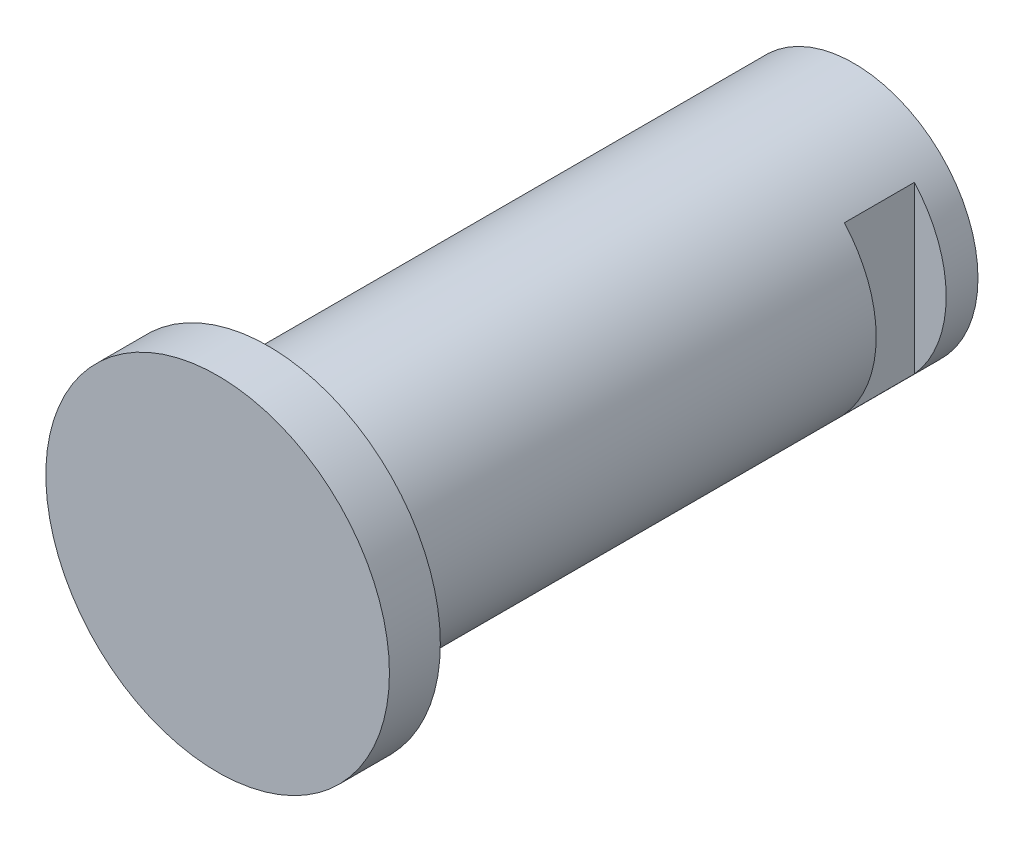
ISO-10303-21;
HEADER;
FILE_DESCRIPTION(('STEP AP214'),'2;1');
FILE_NAME('part.step','',(''),(''),'','','');
FILE_SCHEMA(('AUTOMOTIVE_DESIGN { 1 0 10303 214 1 1 1 1 }'));
ENDSEC;
DATA;
#1=APPLICATION_CONTEXT('core data for automotive mechanical design processes');
#2=APPLICATION_PROTOCOL_DEFINITION('international standard','automotive_design',2000,#1);
#3=PRODUCT_CONTEXT('',#1,'mechanical');
#4=PRODUCT('Part','Part','',(#3));
#5=PRODUCT_RELATED_PRODUCT_CATEGORY('part','',(#4));
#6=PRODUCT_DEFINITION_FORMATION('','',#4);
#7=PRODUCT_DEFINITION_CONTEXT('part definition',#1,'design');
#8=PRODUCT_DEFINITION('design','',#6,#7);
#9=PRODUCT_DEFINITION_SHAPE('','',#8);
#10=(LENGTH_UNIT() NAMED_UNIT(*) SI_UNIT(.MILLI.,.METRE.));
#11=(NAMED_UNIT(*) PLANE_ANGLE_UNIT() SI_UNIT($,.RADIAN.));
#12=(NAMED_UNIT(*) SI_UNIT($,.STERADIAN.) SOLID_ANGLE_UNIT());
#13=UNCERTAINTY_MEASURE_WITH_UNIT(LENGTH_MEASURE(1.E-05),#10,'distance_accuracy_value','');
#14=(GEOMETRIC_REPRESENTATION_CONTEXT(3) GLOBAL_UNCERTAINTY_ASSIGNED_CONTEXT((#13)) GLOBAL_UNIT_ASSIGNED_CONTEXT((#10,
#11,#12)) REPRESENTATION_CONTEXT('',''));
#15=CARTESIAN_POINT('',(0.,0.,0.));
#16=DIRECTION('',(0.,0.,1.));
#17=DIRECTION('',(1.,0.,0.));
#18=AXIS2_PLACEMENT_3D('',#15,#16,#17);
#19=CARTESIAN_POINT('',(0.,0.,25.4));
#20=DIRECTION('',(0.,0.,-1.));
#21=DIRECTION('',(-1.,0.,0.));
#22=AXIS2_PLACEMENT_3D('',#19,#20,#21);
#23=CYLINDRICAL_SURFACE('',#22,4.953);
#24=CARTESIAN_POINT('',(0.,0.,4.064));
#25=DIRECTION('',(0.,0.,1.));
#26=DIRECTION('',(1.,0.,0.));
#27=AXIS2_PLACEMENT_3D('',#24,#25,#26);
#28=CIRCLE('',#27,4.953);
#29=CARTESIAN_POINT('',(3.68300000000001,-3.31175482184294,4.064));
#30=VERTEX_POINT('',#29);
#31=CARTESIAN_POINT('',(3.683,3.31175482184294,4.064));
#32=VERTEX_POINT('',#31);
#33=EDGE_CURVE('E121',#30,#32,#28,.T.);
#34=ORIENTED_EDGE('',*,*,#33,.T.);
#35=DIRECTION('',(0.,0.,-1.));
#36=VECTOR('',#35,1.);
#37=CARTESIAN_POINT('',(3.68300000000001,3.31175482184294,25.4));
#38=LINE('',#37,#36);
#39=CARTESIAN_POINT('',(3.683,3.31175482184294,1.27));
#40=VERTEX_POINT('',#39);
#41=EDGE_CURVE('E11',#32,#40,#38,.T.);
#42=ORIENTED_EDGE('',*,*,#41,.T.);
#43=CARTESIAN_POINT('',(0.,0.,1.27));
#44=DIRECTION('',(0.,0.,1.));
#45=DIRECTION('',(1.,0.,0.));
#46=AXIS2_PLACEMENT_3D('',#43,#44,#45);
#47=CIRCLE('',#46,4.953);
#48=CARTESIAN_POINT('',(3.683,-3.31175482184294,1.27));
#49=VERTEX_POINT('',#48);
#50=EDGE_CURVE('E53',#49,#40,#47,.T.);
#51=ORIENTED_EDGE('',*,*,#50,.F.);
#52=DIRECTION('',(0.,0.,-1.));
#53=VECTOR('',#52,1.);
#54=CARTESIAN_POINT('',(3.68300000000001,-3.31175482184294,25.4));
#55=LINE('',#54,#53);
#56=EDGE_CURVE('E117',#49,#30,#55,.F.);
#57=ORIENTED_EDGE('',*,*,#56,.T.);
#58=EDGE_LOOP('',(#34,#42,#51,#57));
#59=FACE_BOUND('',#58,.T.);
#60=DIRECTION('',(0.,0.,-1.));
#61=VECTOR('',#60,1.);
#62=CARTESIAN_POINT('',(-3.683,3.31175482184295,25.4));
#63=LINE('',#62,#61);
#64=CARTESIAN_POINT('',(-3.683,3.31175482184295,4.064));
#65=VERTEX_POINT('',#64);
#66=CARTESIAN_POINT('',(-3.683,3.31175482184295,1.27));
#67=VERTEX_POINT('',#66);
#68=EDGE_CURVE('E102',#65,#67,#63,.T.);
#69=ORIENTED_EDGE('',*,*,#68,.F.);
#70=CARTESIAN_POINT('',(0.,0.,4.064));
#71=DIRECTION('',(0.,0.,1.));
#72=DIRECTION('',(1.,0.,0.));
#73=AXIS2_PLACEMENT_3D('',#70,#71,#72);
#74=CIRCLE('',#73,4.953);
#75=CARTESIAN_POINT('',(-3.683,-3.31175482184295,4.064));
#76=VERTEX_POINT('',#75);
#77=EDGE_CURVE('E108',#65,#76,#74,.T.);
#78=ORIENTED_EDGE('',*,*,#77,.T.);
#79=DIRECTION('',(0.,0.,-1.));
#80=VECTOR('',#79,1.);
#81=CARTESIAN_POINT('',(-3.683,-3.31175482184295,25.4));
#82=LINE('',#81,#80);
#83=CARTESIAN_POINT('',(-3.683,-3.31175482184295,1.27));
#84=VERTEX_POINT('',#83);
#85=EDGE_CURVE('E95',#84,#76,#82,.F.);
#86=ORIENTED_EDGE('',*,*,#85,.F.);
#87=CARTESIAN_POINT('',(0.,0.,1.27));
#88=DIRECTION('',(0.,0.,1.));
#89=DIRECTION('',(1.,0.,0.));
#90=AXIS2_PLACEMENT_3D('',#87,#88,#89);
#91=CIRCLE('',#90,4.953);
#92=EDGE_CURVE('E86',#67,#84,#91,.T.);
#93=ORIENTED_EDGE('',*,*,#92,.F.);
#94=EDGE_LOOP('',(#69,#78,#86,#93));
#95=FACE_BOUND('',#94,.T.);
#96=CARTESIAN_POINT('',(0.,0.,0.));
#97=DIRECTION('',(0.,0.,1.));
#98=DIRECTION('',(1.,0.,0.));
#99=AXIS2_PLACEMENT_3D('',#96,#97,#98);
#100=CIRCLE('',#99,4.953);
#101=CARTESIAN_POINT('',(4.953,0.,0.));
#102=VERTEX_POINT('',#101);
#103=EDGE_CURVE('E143',#102,#102,#100,.T.);
#104=ORIENTED_EDGE('',*,*,#103,.T.);
#105=EDGE_LOOP('',(#104));
#106=FACE_BOUND('',#105,.T.);
#107=CARTESIAN_POINT('',(0.,0.,23.368));
#108=DIRECTION('',(0.,0.,1.));
#109=DIRECTION('',(1.,0.,0.));
#110=AXIS2_PLACEMENT_3D('',#107,#108,#109);
#111=CIRCLE('',#110,4.953);
#112=CARTESIAN_POINT('',(4.953,0.,23.368));
#113=VERTEX_POINT('',#112);
#114=EDGE_CURVE('E96',#113,#113,#111,.T.);
#115=ORIENTED_EDGE('',*,*,#114,.F.);
#116=EDGE_LOOP('',(#115));
#117=FACE_BOUND('',#116,.T.);
#118=ADVANCED_FACE('F45',(#59,#95,#106,#117),#23,.T.);
#119=CARTESIAN_POINT('',(0.,0.,0.));
#120=DIRECTION('',(0.,0.,1.));
#121=DIRECTION('',(1.,0.,0.));
#122=AXIS2_PLACEMENT_3D('',#119,#120,#121);
#123=PLANE('',#122);
#124=ORIENTED_EDGE('',*,*,#103,.F.);
#125=EDGE_LOOP('',(#124));
#126=FACE_BOUND('',#125,.T.);
#127=ADVANCED_FACE('F155',(#126),#123,.F.);
#128=CARTESIAN_POINT('',(0.,0.,23.368));
#129=DIRECTION('',(0.,0.,1.));
#130=DIRECTION('',(1.,0.,0.));
#131=AXIS2_PLACEMENT_3D('',#128,#129,#130);
#132=CYLINDRICAL_SURFACE('',#131,6.858);
#133=CARTESIAN_POINT('',(0.,0.,23.368));
#134=DIRECTION('',(0.,0.,1.));
#135=DIRECTION('',(1.,0.,0.));
#136=AXIS2_PLACEMENT_3D('',#133,#134,#135);
#137=CIRCLE('',#136,6.858);
#138=CARTESIAN_POINT('',(6.858,0.,23.368));
#139=VERTEX_POINT('',#138);
#140=EDGE_CURVE('E135',#139,#139,#137,.T.);
#141=ORIENTED_EDGE('',*,*,#140,.T.);
#142=EDGE_LOOP('',(#141));
#143=FACE_BOUND('',#142,.T.);
#144=CARTESIAN_POINT('',(0.,0.,25.4));
#145=DIRECTION('',(0.,0.,1.));
#146=DIRECTION('',(1.,0.,0.));
#147=AXIS2_PLACEMENT_3D('',#144,#145,#146);
#148=CIRCLE('',#147,6.858);
#149=CARTESIAN_POINT('',(6.858,0.,25.4));
#150=VERTEX_POINT('',#149);
#151=EDGE_CURVE('E130',#150,#150,#148,.T.);
#152=ORIENTED_EDGE('',*,*,#151,.F.);
#153=EDGE_LOOP('',(#152));
#154=FACE_BOUND('',#153,.T.);
#155=ADVANCED_FACE('F161',(#143,#154),#132,.T.);
#156=CARTESIAN_POINT('',(0.,0.,23.368));
#157=DIRECTION('',(0.,0.,1.));
#158=DIRECTION('',(1.,0.,0.));
#159=AXIS2_PLACEMENT_3D('',#156,#157,#158);
#160=PLANE('',#159);
#161=ORIENTED_EDGE('',*,*,#114,.T.);
#162=EDGE_LOOP('',(#161));
#163=FACE_BOUND('',#162,.T.);
#164=ORIENTED_EDGE('',*,*,#140,.F.);
#165=EDGE_LOOP('',(#164));
#166=FACE_BOUND('',#165,.T.);
#167=ADVANCED_FACE('F151',(#163,#166),#160,.F.);
#168=CARTESIAN_POINT('',(0.,0.,25.4));
#169=DIRECTION('',(0.,0.,1.));
#170=DIRECTION('',(1.,0.,0.));
#171=AXIS2_PLACEMENT_3D('',#168,#169,#170);
#172=PLANE('',#171);
#173=ORIENTED_EDGE('',*,*,#151,.T.);
#174=EDGE_LOOP('',(#173));
#175=FACE_BOUND('',#174,.T.);
#176=ADVANCED_FACE('F170',(#175),#172,.T.);
#177=CARTESIAN_POINT('',(-3.683,-6.858,0.));
#178=DIRECTION('',(-1.,0.,0.));
#179=DIRECTION('',(0.,0.,1.));
#180=AXIS2_PLACEMENT_3D('',#177,#178,#179);
#181=PLANE('',#180);
#182=ORIENTED_EDGE('',*,*,#68,.T.);
#183=DIRECTION('',(0.,1.,0.));
#184=VECTOR('',#183,1.);
#185=CARTESIAN_POINT('',(-3.683,-6.858,1.27));
#186=LINE('',#185,#184);
#187=EDGE_CURVE('E89',#84,#67,#186,.T.);
#188=ORIENTED_EDGE('',*,*,#187,.F.);
#189=ORIENTED_EDGE('',*,*,#85,.T.);
#190=DIRECTION('',(0.,1.,0.));
#191=VECTOR('',#190,1.);
#192=CARTESIAN_POINT('',(-3.683,-6.858,4.064));
#193=LINE('',#192,#191);
#194=EDGE_CURVE('E104',#76,#65,#193,.T.);
#195=ORIENTED_EDGE('',*,*,#194,.T.);
#196=EDGE_LOOP('',(#182,#188,#189,#195));
#197=FACE_BOUND('',#196,.T.);
#198=ADVANCED_FACE('F99',(#197),#181,.T.);
#199=CARTESIAN_POINT('',(0.,-6.858,4.064));
#200=DIRECTION('',(0.,0.,1.));
#201=DIRECTION('',(1.,0.,0.));
#202=AXIS2_PLACEMENT_3D('',#199,#200,#201);
#203=PLANE('',#202);
#204=ORIENTED_EDGE('',*,*,#194,.F.);
#205=ORIENTED_EDGE('',*,*,#77,.F.);
#206=EDGE_LOOP('',(#204,#205));
#207=FACE_BOUND('',#206,.T.);
#208=ADVANCED_FACE('F176',(#207),#203,.F.);
#209=CARTESIAN_POINT('',(0.,-6.858,1.27));
#210=DIRECTION('',(0.,0.,1.));
#211=DIRECTION('',(1.,0.,0.));
#212=AXIS2_PLACEMENT_3D('',#209,#210,#211);
#213=PLANE('',#212);
#214=ORIENTED_EDGE('',*,*,#187,.T.);
#215=ORIENTED_EDGE('',*,*,#92,.T.);
#216=EDGE_LOOP('',(#214,#215));
#217=FACE_BOUND('',#216,.T.);
#218=ADVANCED_FACE('F88',(#217),#213,.T.);
#219=CARTESIAN_POINT('',(0.,-6.858,1.27));
#220=DIRECTION('',(0.,0.,1.));
#221=DIRECTION('',(1.,0.,0.));
#222=AXIS2_PLACEMENT_3D('',#219,#220,#221);
#223=PLANE('',#222);
#224=ORIENTED_EDGE('',*,*,#50,.T.);
#225=DIRECTION('',(0.,1.,0.));
#226=VECTOR('',#225,1.);
#227=CARTESIAN_POINT('',(3.683,-6.858,1.27));
#228=LINE('',#227,#226);
#229=EDGE_CURVE('E127',#49,#40,#228,.T.);
#230=ORIENTED_EDGE('',*,*,#229,.F.);
#231=EDGE_LOOP('',(#224,#230));
#232=FACE_BOUND('',#231,.T.);
#233=ADVANCED_FACE('F179',(#232),#223,.T.);
#234=CARTESIAN_POINT('',(0.,-6.858,4.064));
#235=DIRECTION('',(0.,0.,1.));
#236=DIRECTION('',(1.,0.,0.));
#237=AXIS2_PLACEMENT_3D('',#234,#235,#236);
#238=PLANE('',#237);
#239=ORIENTED_EDGE('',*,*,#33,.F.);
#240=DIRECTION('',(0.,1.,0.));
#241=VECTOR('',#240,1.);
#242=CARTESIAN_POINT('',(3.683,-6.858,4.064));
#243=LINE('',#242,#241);
#244=EDGE_CURVE('E60',#30,#32,#243,.T.);
#245=ORIENTED_EDGE('',*,*,#244,.T.);
#246=EDGE_LOOP('',(#239,#245));
#247=FACE_BOUND('',#246,.T.);
#248=ADVANCED_FACE('F128',(#247),#238,.F.);
#249=CARTESIAN_POINT('',(3.683,-6.858,0.));
#250=DIRECTION('',(-1.,0.,0.));
#251=DIRECTION('',(0.,0.,1.));
#252=AXIS2_PLACEMENT_3D('',#249,#250,#251);
#253=PLANE('',#252);
#254=ORIENTED_EDGE('',*,*,#244,.F.);
#255=ORIENTED_EDGE('',*,*,#56,.F.);
#256=ORIENTED_EDGE('',*,*,#229,.T.);
#257=ORIENTED_EDGE('',*,*,#41,.F.);
#258=EDGE_LOOP('',(#254,#255,#256,#257));
#259=FACE_BOUND('',#258,.T.);
#260=ADVANCED_FACE('F126',(#259),#253,.F.);
#261=CLOSED_SHELL('',(#118,#127,#155,#167,#176,#198,#208,#218,#233,#248,#260));
#262=MANIFOLD_SOLID_BREP('B2',#261);
#263=ADVANCED_BREP_SHAPE_REPRESENTATION('',(#18,#262),#14);
#264=SHAPE_DEFINITION_REPRESENTATION(#9,#263);
ENDSEC;
END-ISO-10303-21;
